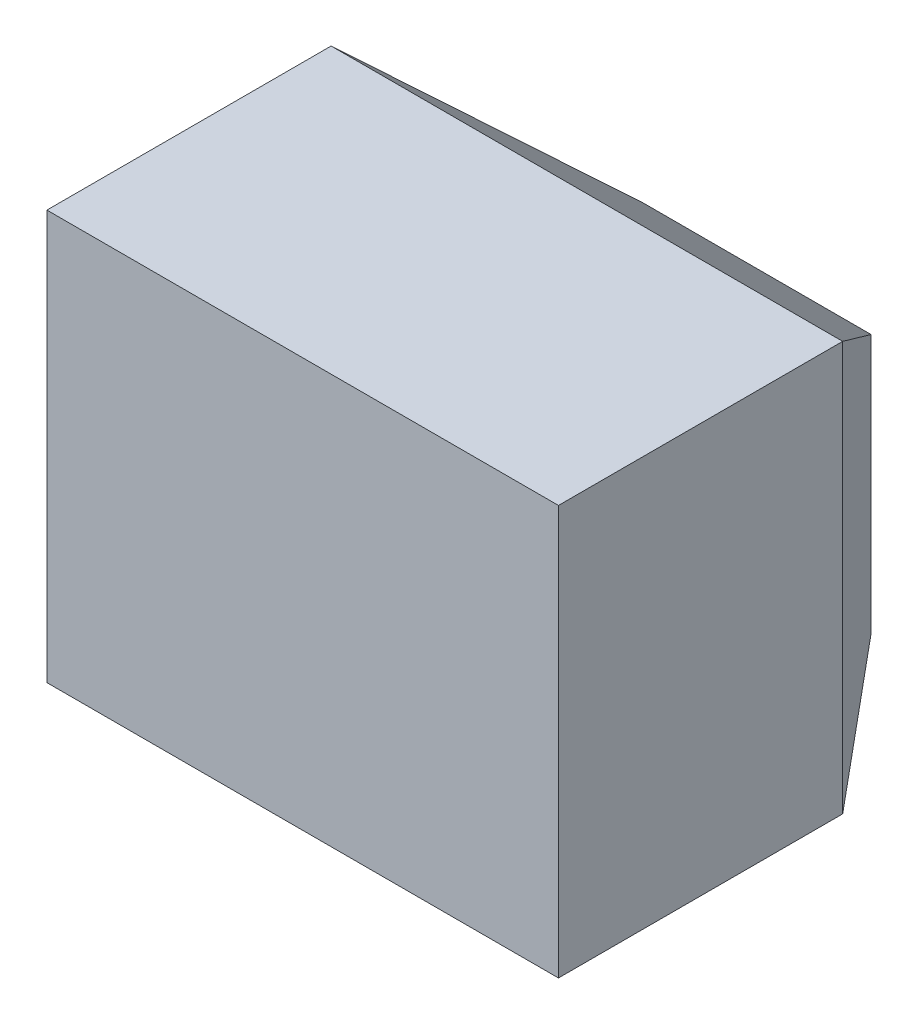
ISO-10303-21;
HEADER;
FILE_DESCRIPTION(('STEP AP214'),'2;1');
FILE_NAME('part.step','',(''),(''),'','','');
FILE_SCHEMA(('AUTOMOTIVE_DESIGN { 1 0 10303 214 1 1 1 1 }'));
ENDSEC;
DATA;
#1=APPLICATION_CONTEXT('core data for automotive mechanical design processes');
#2=APPLICATION_PROTOCOL_DEFINITION('international standard','automotive_design',2000,#1);
#3=PRODUCT_CONTEXT('',#1,'mechanical');
#4=PRODUCT('Part','Part','',(#3));
#5=PRODUCT_RELATED_PRODUCT_CATEGORY('part','',(#4));
#6=PRODUCT_DEFINITION_FORMATION('','',#4);
#7=PRODUCT_DEFINITION_CONTEXT('part definition',#1,'design');
#8=PRODUCT_DEFINITION('design','',#6,#7);
#9=PRODUCT_DEFINITION_SHAPE('','',#8);
#10=(LENGTH_UNIT() NAMED_UNIT(*) SI_UNIT(.MILLI.,.METRE.));
#11=(NAMED_UNIT(*) PLANE_ANGLE_UNIT() SI_UNIT($,.RADIAN.));
#12=(NAMED_UNIT(*) SI_UNIT($,.STERADIAN.) SOLID_ANGLE_UNIT());
#13=UNCERTAINTY_MEASURE_WITH_UNIT(LENGTH_MEASURE(1.E-05),#10,'distance_accuracy_value','');
#14=(GEOMETRIC_REPRESENTATION_CONTEXT(3) GLOBAL_UNCERTAINTY_ASSIGNED_CONTEXT((#13)) GLOBAL_UNIT_ASSIGNED_CONTEXT((#10,
#11,#12)) REPRESENTATION_CONTEXT('',''));
#15=CARTESIAN_POINT('',(0.,0.,0.));
#16=DIRECTION('',(0.,0.,1.));
#17=DIRECTION('',(1.,0.,0.));
#18=AXIS2_PLACEMENT_3D('',#15,#16,#17);
#19=CARTESIAN_POINT('',(225.,360.,0.));
#20=DIRECTION('',(-1.,0.,0.));
#21=DIRECTION('',(0.,0.,1.));
#22=AXIS2_PLACEMENT_3D('',#19,#20,#21);
#23=PLANE('',#22);
#24=DIRECTION('',(0.,0.,-1.));
#25=VECTOR('',#24,1.);
#26=CARTESIAN_POINT('',(225.,0.,0.));
#27=LINE('',#26,#25);
#28=CARTESIAN_POINT('',(225.,0.,0.));
#29=VERTEX_POINT('',#28);
#30=CARTESIAN_POINT('',(225.,0.,-250.));
#31=VERTEX_POINT('',#30);
#32=EDGE_CURVE('E111',#29,#31,#27,.T.);
#33=ORIENTED_EDGE('',*,*,#32,.T.);
#34=DIRECTION('',(0.,-1.,0.));
#35=VECTOR('',#34,1.);
#36=CARTESIAN_POINT('',(225.,360.,-250.));
#37=LINE('',#36,#35);
#38=CARTESIAN_POINT('',(225.,360.,-250.));
#39=VERTEX_POINT('',#38);
#40=EDGE_CURVE('E11',#39,#31,#37,.T.);
#41=ORIENTED_EDGE('',*,*,#40,.F.);
#42=DIRECTION('',(0.,0.,-1.));
#43=VECTOR('',#42,1.);
#44=CARTESIAN_POINT('',(225.,360.,0.));
#45=LINE('',#44,#43);
#46=CARTESIAN_POINT('',(225.,360.,0.));
#47=VERTEX_POINT('',#46);
#48=EDGE_CURVE('E114',#47,#39,#45,.T.);
#49=ORIENTED_EDGE('',*,*,#48,.F.);
#50=DIRECTION('',(0.,-1.,0.));
#51=VECTOR('',#50,1.);
#52=CARTESIAN_POINT('',(225.,360.,0.));
#53=LINE('',#52,#51);
#54=EDGE_CURVE('E120',#47,#29,#53,.T.);
#55=ORIENTED_EDGE('',*,*,#54,.T.);
#56=EDGE_LOOP('',(#33,#41,#49,#55));
#57=FACE_BOUND('',#56,.T.);
#58=ADVANCED_FACE('F37',(#57),#23,.F.);
#59=CARTESIAN_POINT('',(225.,360.,-250.));
#60=DIRECTION('',(-0.768221279597376,0.,0.64018439966448));
#61=DIRECTION('',(0.64018439966448,0.,0.768221279597376));
#62=AXIS2_PLACEMENT_3D('',#59,#60,#61);
#63=PLANE('',#62);
#64=DIRECTION('',(0.,-1.,0.));
#65=VECTOR('',#64,1.);
#66=CARTESIAN_POINT('',(100.,360.,-400.));
#67=LINE('',#66,#65);
#68=CARTESIAN_POINT('',(100.,227.71243444677,-400.));
#69=VERTEX_POINT('',#68);
#70=CARTESIAN_POINT('',(100.,0.,-400.));
#71=VERTEX_POINT('',#70);
#72=EDGE_CURVE('E45',#69,#71,#67,.T.);
#73=ORIENTED_EDGE('',*,*,#72,.F.);
#74=DIRECTION('',(0.52999894000318,0.560898156150503,0.635998728003816));
#75=VECTOR('',#74,1.);
#76=CARTESIAN_POINT('',(225.,360.,-250.));
#77=LINE('',#76,#75);
#78=EDGE_CURVE('E100',#69,#39,#77,.T.);
#79=ORIENTED_EDGE('',*,*,#78,.T.);
#80=ORIENTED_EDGE('',*,*,#40,.T.);
#81=DIRECTION('',(-0.64018439966448,0.,-0.768221279597376));
#82=VECTOR('',#81,1.);
#83=CARTESIAN_POINT('',(225.,0.,-250.));
#84=LINE('',#83,#82);
#85=EDGE_CURVE('E122',#31,#71,#84,.T.);
#86=ORIENTED_EDGE('',*,*,#85,.T.);
#87=EDGE_LOOP('',(#73,#79,#80,#86));
#88=FACE_BOUND('',#87,.T.);
#89=ADVANCED_FACE('F107',(#88),#63,.F.);
#90=CARTESIAN_POINT('',(100.,360.,-400.));
#91=DIRECTION('',(0.,0.,1.));
#92=DIRECTION('',(1.,0.,0.));
#93=AXIS2_PLACEMENT_3D('',#90,#91,#92);
#94=PLANE('',#93);
#95=DIRECTION('',(0.,-1.,0.));
#96=VECTOR('',#95,1.);
#97=CARTESIAN_POINT('',(-100.,360.,-400.));
#98=LINE('',#97,#96);
#99=CARTESIAN_POINT('',(-100.,227.71243444677,-400.));
#100=VERTEX_POINT('',#99);
#101=CARTESIAN_POINT('',(-100.,0.,-400.));
#102=VERTEX_POINT('',#101);
#103=EDGE_CURVE('E140',#100,#102,#98,.T.);
#104=ORIENTED_EDGE('',*,*,#103,.F.);
#105=DIRECTION('',(1.,0.,0.));
#106=VECTOR('',#105,1.);
#107=CARTESIAN_POINT('',(-225.,227.71243444677,-400.));
#108=LINE('',#107,#106);
#109=EDGE_CURVE('E103',#100,#69,#108,.T.);
#110=ORIENTED_EDGE('',*,*,#109,.T.);
#111=ORIENTED_EDGE('',*,*,#72,.T.);
#112=DIRECTION('',(-1.,0.,0.));
#113=VECTOR('',#112,1.);
#114=CARTESIAN_POINT('',(100.,0.,-400.));
#115=LINE('',#114,#113);
#116=EDGE_CURVE('E124',#71,#102,#115,.T.);
#117=ORIENTED_EDGE('',*,*,#116,.T.);
#118=EDGE_LOOP('',(#104,#110,#111,#117));
#119=FACE_BOUND('',#118,.T.);
#120=ADVANCED_FACE('F143',(#119),#94,.F.);
#121=CARTESIAN_POINT('',(-225.,360.,-250.));
#122=DIRECTION('',(0.768221279597376,0.,0.64018439966448));
#123=DIRECTION('',(0.64018439966448,0.,-0.768221279597376));
#124=AXIS2_PLACEMENT_3D('',#121,#122,#123);
#125=PLANE('',#124);
#126=DIRECTION('',(0.,-1.,0.));
#127=VECTOR('',#126,1.);
#128=CARTESIAN_POINT('',(-225.,360.,-250.));
#129=LINE('',#128,#127);
#130=CARTESIAN_POINT('',(-225.,360.,-250.));
#131=VERTEX_POINT('',#130);
#132=CARTESIAN_POINT('',(-225.,0.,-250.));
#133=VERTEX_POINT('',#132);
#134=EDGE_CURVE('E138',#131,#133,#129,.T.);
#135=ORIENTED_EDGE('',*,*,#134,.F.);
#136=DIRECTION('',(0.52999894000318,-0.560898156150503,-0.635998728003816));
#137=VECTOR('',#136,1.);
#138=CARTESIAN_POINT('',(-225.,360.,-250.));
#139=LINE('',#138,#137);
#140=EDGE_CURVE('E89',#131,#100,#139,.T.);
#141=ORIENTED_EDGE('',*,*,#140,.T.);
#142=ORIENTED_EDGE('',*,*,#103,.T.);
#143=DIRECTION('',(-0.64018439966448,0.,0.768221279597376));
#144=VECTOR('',#143,1.);
#145=CARTESIAN_POINT('',(-225.,0.,-250.));
#146=LINE('',#145,#144);
#147=EDGE_CURVE('E131',#102,#133,#146,.T.);
#148=ORIENTED_EDGE('',*,*,#147,.T.);
#149=EDGE_LOOP('',(#135,#141,#142,#148));
#150=FACE_BOUND('',#149,.T.);
#151=ADVANCED_FACE('F148',(#150),#125,.F.);
#152=CARTESIAN_POINT('',(-225.,360.,0.));
#153=DIRECTION('',(1.,0.,0.));
#154=DIRECTION('',(0.,0.,-1.));
#155=AXIS2_PLACEMENT_3D('',#152,#153,#154);
#156=PLANE('',#155);
#157=DIRECTION('',(0.,0.,1.));
#158=VECTOR('',#157,1.);
#159=CARTESIAN_POINT('',(-225.,0.,0.));
#160=LINE('',#159,#158);
#161=CARTESIAN_POINT('',(-225.,0.,0.));
#162=VERTEX_POINT('',#161);
#163=EDGE_CURVE('E77',#133,#162,#160,.T.);
#164=ORIENTED_EDGE('',*,*,#163,.T.);
#165=DIRECTION('',(0.,-1.,0.));
#166=VECTOR('',#165,1.);
#167=CARTESIAN_POINT('',(-225.,360.,0.));
#168=LINE('',#167,#166);
#169=CARTESIAN_POINT('',(-225.,360.,0.));
#170=VERTEX_POINT('',#169);
#171=EDGE_CURVE('E136',#170,#162,#168,.T.);
#172=ORIENTED_EDGE('',*,*,#171,.F.);
#173=DIRECTION('',(0.,0.,1.));
#174=VECTOR('',#173,1.);
#175=CARTESIAN_POINT('',(-225.,360.,0.));
#176=LINE('',#175,#174);
#177=EDGE_CURVE('E117',#131,#170,#176,.T.);
#178=ORIENTED_EDGE('',*,*,#177,.F.);
#179=ORIENTED_EDGE('',*,*,#134,.T.);
#180=EDGE_LOOP('',(#164,#172,#178,#179));
#181=FACE_BOUND('',#180,.T.);
#182=ADVANCED_FACE('F150',(#181),#156,.F.);
#183=CARTESIAN_POINT('',(-225.,360.,0.));
#184=DIRECTION('',(0.,0.,-1.));
#185=DIRECTION('',(-1.,0.,0.));
#186=AXIS2_PLACEMENT_3D('',#183,#184,#185);
#187=PLANE('',#186);
#188=DIRECTION('',(1.,0.,0.));
#189=VECTOR('',#188,1.);
#190=CARTESIAN_POINT('',(-225.,0.,0.));
#191=LINE('',#190,#189);
#192=EDGE_CURVE('E82',#162,#29,#191,.T.);
#193=ORIENTED_EDGE('',*,*,#192,.T.);
#194=ORIENTED_EDGE('',*,*,#54,.F.);
#195=DIRECTION('',(1.,0.,0.));
#196=VECTOR('',#195,1.);
#197=CARTESIAN_POINT('',(-225.,360.,0.));
#198=LINE('',#197,#196);
#199=EDGE_CURVE('E53',#170,#47,#198,.T.);
#200=ORIENTED_EDGE('',*,*,#199,.F.);
#201=ORIENTED_EDGE('',*,*,#171,.T.);
#202=EDGE_LOOP('',(#193,#194,#200,#201));
#203=FACE_BOUND('',#202,.T.);
#204=ADVANCED_FACE('F153',(#203),#187,.F.);
#205=CARTESIAN_POINT('',(0.,360.,0.));
#206=DIRECTION('',(0.,1.,0.));
#207=DIRECTION('',(0.,0.,1.));
#208=AXIS2_PLACEMENT_3D('',#205,#206,#207);
#209=PLANE('',#208);
#210=DIRECTION('',(1.,0.,0.));
#211=VECTOR('',#210,1.);
#212=CARTESIAN_POINT('',(-225.,360.,-250.));
#213=LINE('',#212,#211);
#214=EDGE_CURVE('E97',#131,#39,#213,.T.);
#215=ORIENTED_EDGE('',*,*,#214,.F.);
#216=ORIENTED_EDGE('',*,*,#177,.T.);
#217=ORIENTED_EDGE('',*,*,#199,.T.);
#218=ORIENTED_EDGE('',*,*,#48,.T.);
#219=EDGE_LOOP('',(#215,#216,#217,#218));
#220=FACE_BOUND('',#219,.T.);
#221=ADVANCED_FACE('F115',(#220),#209,.T.);
#222=CARTESIAN_POINT('',(0.,0.,0.));
#223=DIRECTION('',(0.,1.,0.));
#224=DIRECTION('',(0.,0.,1.));
#225=AXIS2_PLACEMENT_3D('',#222,#223,#224);
#226=PLANE('',#225);
#227=ORIENTED_EDGE('',*,*,#32,.F.);
#228=ORIENTED_EDGE('',*,*,#192,.F.);
#229=ORIENTED_EDGE('',*,*,#163,.F.);
#230=ORIENTED_EDGE('',*,*,#147,.F.);
#231=ORIENTED_EDGE('',*,*,#116,.F.);
#232=ORIENTED_EDGE('',*,*,#85,.F.);
#233=EDGE_LOOP('',(#227,#228,#229,#230,#231,#232));
#234=FACE_BOUND('',#233,.T.);
#235=ADVANCED_FACE('F146',(#234),#226,.F.);
#236=CARTESIAN_POINT('',(-225.,360.,-250.));
#237=DIRECTION('',(0.,-0.75,0.661437827766148));
#238=DIRECTION('',(0.,-0.661437827766148,-0.75));
#239=AXIS2_PLACEMENT_3D('',#236,#237,#238);
#240=PLANE('',#239);
#241=ORIENTED_EDGE('',*,*,#109,.F.);
#242=ORIENTED_EDGE('',*,*,#140,.F.);
#243=ORIENTED_EDGE('',*,*,#214,.T.);
#244=ORIENTED_EDGE('',*,*,#78,.F.);
#245=EDGE_LOOP('',(#241,#242,#243,#244));
#246=FACE_BOUND('',#245,.T.);
#247=ADVANCED_FACE('F99',(#246),#240,.F.);
#248=CLOSED_SHELL('',(#58,#89,#120,#151,#182,#204,#221,#235,#247));
#249=MANIFOLD_SOLID_BREP('B2',#248);
#250=ADVANCED_BREP_SHAPE_REPRESENTATION('',(#18,#249),#14);
#251=SHAPE_DEFINITION_REPRESENTATION(#9,#250);
ENDSEC;
END-ISO-10303-21;
